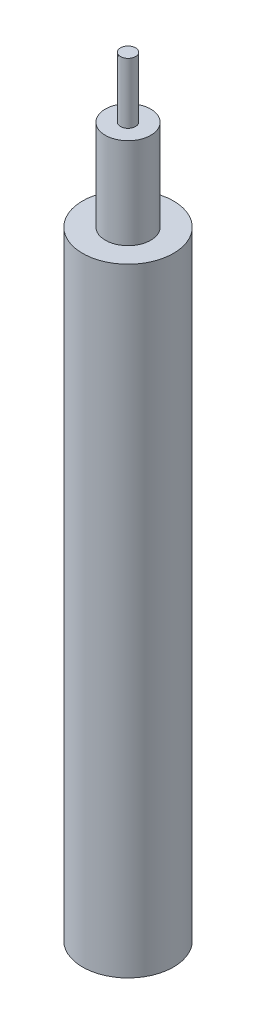
ISO-10303-21;
HEADER;
FILE_DESCRIPTION(('STEP AP214'),'2;1');
FILE_NAME('part.step','',(''),(''),'','','');
FILE_SCHEMA(('AUTOMOTIVE_DESIGN { 1 0 10303 214 1 1 1 1 }'));
ENDSEC;
DATA;
#1=APPLICATION_CONTEXT('core data for automotive mechanical design processes');
#2=APPLICATION_PROTOCOL_DEFINITION('international standard','automotive_design',2000,#1);
#3=PRODUCT_CONTEXT('',#1,'mechanical');
#4=PRODUCT('Part','Part','',(#3));
#5=PRODUCT_RELATED_PRODUCT_CATEGORY('part','',(#4));
#6=PRODUCT_DEFINITION_FORMATION('','',#4);
#7=PRODUCT_DEFINITION_CONTEXT('part definition',#1,'design');
#8=PRODUCT_DEFINITION('design','',#6,#7);
#9=PRODUCT_DEFINITION_SHAPE('','',#8);
#10=(LENGTH_UNIT() NAMED_UNIT(*) SI_UNIT(.MILLI.,.METRE.));
#11=(NAMED_UNIT(*) PLANE_ANGLE_UNIT() SI_UNIT($,.RADIAN.));
#12=(NAMED_UNIT(*) SI_UNIT($,.STERADIAN.) SOLID_ANGLE_UNIT());
#13=UNCERTAINTY_MEASURE_WITH_UNIT(LENGTH_MEASURE(1.E-05),#10,'distance_accuracy_value','');
#14=(GEOMETRIC_REPRESENTATION_CONTEXT(3) GLOBAL_UNCERTAINTY_ASSIGNED_CONTEXT((#13)) GLOBAL_UNIT_ASSIGNED_CONTEXT((#10,
#11,#12)) REPRESENTATION_CONTEXT('',''));
#15=CARTESIAN_POINT('',(0.,0.,0.));
#16=DIRECTION('',(0.,0.,1.));
#17=DIRECTION('',(1.,0.,0.));
#18=AXIS2_PLACEMENT_3D('',#15,#16,#17);
#19=CARTESIAN_POINT('',(0.,-9.525,0.));
#20=DIRECTION('',(0.,1.,0.));
#21=DIRECTION('',(0.,0.,1.));
#22=AXIS2_PLACEMENT_3D('',#19,#20,#21);
#23=CYLINDRICAL_SURFACE('',#22,2.38125);
#24=CARTESIAN_POINT('',(0.,-9.525,0.));
#25=DIRECTION('',(0.,1.,0.));
#26=DIRECTION('',(0.,0.,1.));
#27=AXIS2_PLACEMENT_3D('',#24,#25,#26);
#28=CIRCLE('',#27,2.38125);
#29=CARTESIAN_POINT('',(0.,-9.525,2.38125));
#30=VERTEX_POINT('',#29);
#31=EDGE_CURVE('E50',#30,#30,#28,.T.);
#32=CARTESIAN_POINT('',(0.,0.,0.));
#33=DIRECTION('',(0.,1.,0.));
#34=DIRECTION('',(0.,0.,1.));
#35=AXIS2_PLACEMENT_3D('',#32,#33,#34);
#36=CIRCLE('',#35,2.38125);
#37=CARTESIAN_POINT('',(0.,0.,2.38125));
#38=VERTEX_POINT('',#37);
#39=EDGE_CURVE('E40',#38,#38,#36,.T.);
#40=CARTESIAN_POINT('',(0.,-9.525,2.38125));
#41=CARTESIAN_POINT('',(0.,-9.42578125,2.38125));
#42=CARTESIAN_POINT('',(0.,-9.3265625,2.38125));
#43=CARTESIAN_POINT('',(0.,-9.128125,2.38125));
#44=CARTESIAN_POINT('',(0.,-9.02890625,2.38125));
#45=CARTESIAN_POINT('',(0.,-8.83046875,2.38125));
#46=CARTESIAN_POINT('',(0.,-8.73125,2.38125));
#47=CARTESIAN_POINT('',(0.,-8.5328125,2.38125));
#48=CARTESIAN_POINT('',(0.,-8.43359375,2.38125));
#49=CARTESIAN_POINT('',(0.,-8.23515625,2.38125));
#50=CARTESIAN_POINT('',(0.,-8.1359375,2.38125));
#51=CARTESIAN_POINT('',(0.,-7.9375,2.38125));
#52=CARTESIAN_POINT('',(0.,-7.83828125,2.38125));
#53=CARTESIAN_POINT('',(0.,-7.63984375,2.38125));
#54=CARTESIAN_POINT('',(0.,-7.540625,2.38125));
#55=CARTESIAN_POINT('',(0.,-7.3421875,2.38125));
#56=CARTESIAN_POINT('',(0.,-7.24296875,2.38125));
#57=CARTESIAN_POINT('',(0.,-7.04453125,2.38125));
#58=CARTESIAN_POINT('',(0.,-6.9453125,2.38125));
#59=CARTESIAN_POINT('',(0.,-6.746875,2.38125));
#60=CARTESIAN_POINT('',(0.,-6.64765625,2.38125));
#61=CARTESIAN_POINT('',(0.,-6.44921875,2.38125));
#62=CARTESIAN_POINT('',(0.,-6.35,2.38125));
#63=CARTESIAN_POINT('',(0.,-6.1515625,2.38125));
#64=CARTESIAN_POINT('',(0.,-6.05234375,2.38125));
#65=CARTESIAN_POINT('',(0.,-5.85390625,2.38125));
#66=CARTESIAN_POINT('',(0.,-5.7546875,2.38125));
#67=CARTESIAN_POINT('',(0.,-5.55625,2.38125));
#68=CARTESIAN_POINT('',(0.,-5.45703125,2.38125));
#69=CARTESIAN_POINT('',(0.,-5.25859375,2.38125));
#70=CARTESIAN_POINT('',(0.,-5.159375,2.38125));
#71=CARTESIAN_POINT('',(0.,-4.9609375,2.38125));
#72=CARTESIAN_POINT('',(0.,-4.86171875,2.38125));
#73=CARTESIAN_POINT('',(0.,-4.66328125,2.38125));
#74=CARTESIAN_POINT('',(0.,-4.5640625,2.38125));
#75=CARTESIAN_POINT('',(0.,-4.365625,2.38125));
#76=CARTESIAN_POINT('',(0.,-4.26640625,2.38125));
#77=CARTESIAN_POINT('',(0.,-4.06796875,2.38125));
#78=CARTESIAN_POINT('',(0.,-3.96875,2.38125));
#79=CARTESIAN_POINT('',(0.,-3.7703125,2.38125));
#80=CARTESIAN_POINT('',(0.,-3.67109375,2.38125));
#81=CARTESIAN_POINT('',(0.,-3.47265625,2.38125));
#82=CARTESIAN_POINT('',(0.,-3.3734375,2.38125));
#83=CARTESIAN_POINT('',(0.,-3.175,2.38125));
#84=CARTESIAN_POINT('',(0.,-3.07578125,2.38125));
#85=CARTESIAN_POINT('',(0.,-2.87734375,2.38125));
#86=CARTESIAN_POINT('',(0.,-2.778125,2.38125));
#87=CARTESIAN_POINT('',(0.,-2.5796875,2.38125));
#88=CARTESIAN_POINT('',(0.,-2.48046875,2.38125));
#89=CARTESIAN_POINT('',(0.,-2.28203125,2.38125));
#90=CARTESIAN_POINT('',(0.,-2.1828125,2.38125));
#91=CARTESIAN_POINT('',(0.,-1.984375,2.38125));
#92=CARTESIAN_POINT('',(0.,-1.88515625,2.38125));
#93=CARTESIAN_POINT('',(0.,-1.68671875,2.38125));
#94=CARTESIAN_POINT('',(0.,-1.5875,2.38125));
#95=CARTESIAN_POINT('',(0.,-1.3890625,2.38125));
#96=CARTESIAN_POINT('',(0.,-1.28984375,2.38125));
#97=CARTESIAN_POINT('',(0.,-1.09140625,2.38125));
#98=CARTESIAN_POINT('',(0.,-0.992187500000001,2.38125));
#99=CARTESIAN_POINT('',(0.,-0.793750000000001,2.38125));
#100=CARTESIAN_POINT('',(0.,-0.69453125,2.38125));
#101=CARTESIAN_POINT('',(0.,-0.49609375,2.38125));
#102=CARTESIAN_POINT('',(0.,-0.396875,2.38125));
#103=CARTESIAN_POINT('',(0.,-0.1984375,2.38125));
#104=CARTESIAN_POINT('',(0.,-0.0992187500000001,2.38125));
#105=CARTESIAN_POINT('',(0.,0.,2.38125));
#106=B_SPLINE_CURVE_WITH_KNOTS('',3,(#40,#41,#42,#43,#44,#45,#46,#47,#48,#49,#50,#51,#52,#53,
#54,#55,#56,#57,#58,#59,#60,#61,#62,#63,#64,#65,#66,#67,#68,#69,#70,#71,#72,#73,#74,#75,#76,#77,
#78,#79,#80,#81,#82,#83,#84,#85,#86,#87,#88,#89,#90,#91,#92,#93,#94,#95,#96,#97,#98,#99,#100,
#101,#102,#103,#104,#105),.UNSPECIFIED.,.F.,.F.,(4,2,2,2,2,2,2,2,2,2,2,2,2,2,2,2,2,2,2,2,2,2,2,
2,2,2,2,2,2,2,2,2,4),(0.,0.297656249999998,0.595312499999999,0.892968749999999,1.190625,
1.48828125,1.7859375,2.08359375,2.38125,2.67890625,2.9765625,3.27421875,3.571875,3.86953125,
4.1671875,4.46484375,4.7625,5.06015625,5.3578125,5.65546875,5.953125,6.25078125,6.5484375,
6.84609375,7.14375,7.44140625,7.7390625,8.03671875,8.334375,8.63203125,8.9296875,9.22734375,
9.525),.UNSPECIFIED.);
#107=EDGE_CURVE('BSEAM37',#30,#38,#106,.T.);
#108=ORIENTED_EDGE('',*,*,#31,.T.);
#109=ORIENTED_EDGE('',*,*,#39,.F.);
#110=ORIENTED_EDGE('',*,*,#107,.T.);
#111=ORIENTED_EDGE('',*,*,#107,.F.);
#112=EDGE_LOOP('',(#108,#110,#109,#111));
#113=FACE_BOUND('',#112,.T.);
#114=ADVANCED_FACE('F37',(#113),#23,.T.);
#115=CARTESIAN_POINT('',(0.,0.,0.));
#116=DIRECTION('',(0.,1.,0.));
#117=DIRECTION('',(0.,0.,1.));
#118=AXIS2_PLACEMENT_3D('',#115,#116,#117);
#119=PLANE('',#118);
#120=CARTESIAN_POINT('',(0.,0.,0.));
#121=DIRECTION('',(0.,1.,0.));
#122=DIRECTION('',(0.,0.,1.));
#123=AXIS2_PLACEMENT_3D('',#120,#121,#122);
#124=CIRCLE('',#123,0.79375);
#125=CARTESIAN_POINT('',(0.,0.,0.79375));
#126=VERTEX_POINT('',#125);
#127=EDGE_CURVE('E10',#126,#126,#124,.T.);
#128=ORIENTED_EDGE('',*,*,#127,.F.);
#129=EDGE_LOOP('',(#128));
#130=FACE_BOUND('',#129,.T.);
#131=ORIENTED_EDGE('',*,*,#39,.T.);
#132=EDGE_LOOP('',(#131));
#133=FACE_BOUND('',#132,.T.);
#134=ADVANCED_FACE('F77',(#130,#133),#119,.T.);
#135=CARTESIAN_POINT('',(0.,-74.295,0.));
#136=DIRECTION('',(0.,1.,0.));
#137=DIRECTION('',(0.,0.,1.));
#138=AXIS2_PLACEMENT_3D('',#135,#136,#137);
#139=CYLINDRICAL_SURFACE('',#138,4.7625);
#140=CARTESIAN_POINT('',(0.,-74.295,0.));
#141=DIRECTION('',(0.,-1.,0.));
#142=DIRECTION('',(0.,0.,-1.));
#143=AXIS2_PLACEMENT_3D('',#140,#141,#142);
#144=CIRCLE('',#143,4.7625);
#145=CARTESIAN_POINT('',(0.,-74.295,-4.7625));
#146=VERTEX_POINT('',#145);
#147=EDGE_CURVE('E54',#146,#146,#144,.T.);
#148=ORIENTED_EDGE('',*,*,#147,.F.);
#149=EDGE_LOOP('',(#148));
#150=FACE_BOUND('',#149,.T.);
#151=CARTESIAN_POINT('',(0.,-9.525,0.));
#152=DIRECTION('',(0.,-1.,0.));
#153=DIRECTION('',(0.,0.,-1.));
#154=AXIS2_PLACEMENT_3D('',#151,#152,#153);
#155=CIRCLE('',#154,4.7625);
#156=CARTESIAN_POINT('',(0.,-9.525,-4.7625));
#157=VERTEX_POINT('',#156);
#158=EDGE_CURVE('E58',#157,#157,#155,.T.);
#159=ORIENTED_EDGE('',*,*,#158,.T.);
#160=EDGE_LOOP('',(#159));
#161=FACE_BOUND('',#160,.T.);
#162=ADVANCED_FACE('F75',(#150,#161),#139,.T.);
#163=CARTESIAN_POINT('',(0.,-74.295,0.));
#164=DIRECTION('',(0.,-1.,0.));
#165=DIRECTION('',(0.,0.,-1.));
#166=AXIS2_PLACEMENT_3D('',#163,#164,#165);
#167=PLANE('',#166);
#168=ORIENTED_EDGE('',*,*,#147,.T.);
#169=EDGE_LOOP('',(#168));
#170=FACE_BOUND('',#169,.T.);
#171=ADVANCED_FACE('F71',(#170),#167,.T.);
#172=CARTESIAN_POINT('',(0.,-9.525,0.));
#173=DIRECTION('',(0.,-1.,0.));
#174=DIRECTION('',(0.,0.,-1.));
#175=AXIS2_PLACEMENT_3D('',#172,#173,#174);
#176=PLANE('',#175);
#177=ORIENTED_EDGE('',*,*,#31,.F.);
#178=EDGE_LOOP('',(#177));
#179=FACE_BOUND('',#178,.T.);
#180=ORIENTED_EDGE('',*,*,#158,.F.);
#181=EDGE_LOOP('',(#180));
#182=FACE_BOUND('',#181,.T.);
#183=ADVANCED_FACE('F67',(#179,#182),#176,.F.);
#184=CARTESIAN_POINT('',(0.,6.35,0.));
#185=DIRECTION('',(0.,-1.,0.));
#186=DIRECTION('',(0.,0.,-1.));
#187=AXIS2_PLACEMENT_3D('',#184,#185,#186);
#188=CYLINDRICAL_SURFACE('',#187,0.79375);
#189=CARTESIAN_POINT('',(0.,6.35,0.));
#190=DIRECTION('',(0.,1.,0.));
#191=DIRECTION('',(0.,0.,1.));
#192=AXIS2_PLACEMENT_3D('',#189,#190,#191);
#193=CIRCLE('',#192,0.79375);
#194=CARTESIAN_POINT('',(0.,6.35,0.79375));
#195=VERTEX_POINT('',#194);
#196=EDGE_CURVE('E53',#195,#195,#193,.T.);
#197=ORIENTED_EDGE('',*,*,#196,.F.);
#198=EDGE_LOOP('',(#197));
#199=FACE_BOUND('',#198,.T.);
#200=ORIENTED_EDGE('',*,*,#127,.T.);
#201=EDGE_LOOP('',(#200));
#202=FACE_BOUND('',#201,.T.);
#203=ADVANCED_FACE('F70',(#199,#202),#188,.T.);
#204=CARTESIAN_POINT('',(0.,6.35,0.));
#205=DIRECTION('',(0.,1.,0.));
#206=DIRECTION('',(0.,0.,1.));
#207=AXIS2_PLACEMENT_3D('',#204,#205,#206);
#208=PLANE('',#207);
#209=ORIENTED_EDGE('',*,*,#196,.T.);
#210=EDGE_LOOP('',(#209));
#211=FACE_BOUND('',#210,.T.);
#212=ADVANCED_FACE('F109',(#211),#208,.T.);
#213=CLOSED_SHELL('',(#114,#134,#162,#171,#183,#203,#212));
#214=MANIFOLD_SOLID_BREP('B2',#213);
#215=ADVANCED_BREP_SHAPE_REPRESENTATION('',(#18,#214),#14);
#216=SHAPE_DEFINITION_REPRESENTATION(#9,#215);
ENDSEC;
END-ISO-10303-21;
